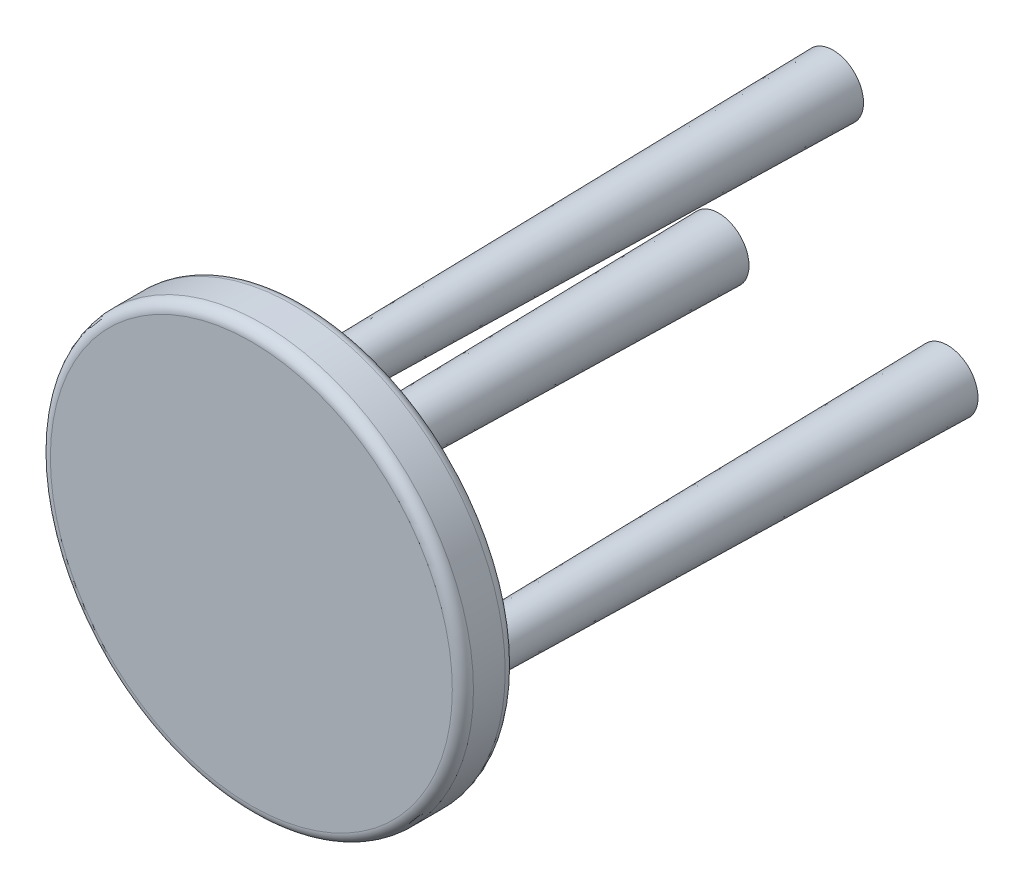
ISO-10303-21;
HEADER;
FILE_DESCRIPTION(('STEP AP214'),'2;1');
FILE_NAME('part.step','',(''),(''),'','','');
FILE_SCHEMA(('AUTOMOTIVE_DESIGN { 1 0 10303 214 1 1 1 1 }'));
ENDSEC;
DATA;
#1=APPLICATION_CONTEXT('core data for automotive mechanical design processes');
#2=APPLICATION_PROTOCOL_DEFINITION('international standard','automotive_design',2000,#1);
#3=PRODUCT_CONTEXT('',#1,'mechanical');
#4=PRODUCT('Part','Part','',(#3));
#5=PRODUCT_RELATED_PRODUCT_CATEGORY('part','',(#4));
#6=PRODUCT_DEFINITION_FORMATION('','',#4);
#7=PRODUCT_DEFINITION_CONTEXT('part definition',#1,'design');
#8=PRODUCT_DEFINITION('design','',#6,#7);
#9=PRODUCT_DEFINITION_SHAPE('','',#8);
#10=(LENGTH_UNIT() NAMED_UNIT(*) SI_UNIT(.MILLI.,.METRE.));
#11=(NAMED_UNIT(*) PLANE_ANGLE_UNIT() SI_UNIT($,.RADIAN.));
#12=(NAMED_UNIT(*) SI_UNIT($,.STERADIAN.) SOLID_ANGLE_UNIT());
#13=UNCERTAINTY_MEASURE_WITH_UNIT(LENGTH_MEASURE(1.E-05),#10,'distance_accuracy_value','');
#14=(GEOMETRIC_REPRESENTATION_CONTEXT(3) GLOBAL_UNCERTAINTY_ASSIGNED_CONTEXT((#13)) GLOBAL_UNIT_ASSIGNED_CONTEXT((#10,
#11,#12)) REPRESENTATION_CONTEXT('',''));
#15=CARTESIAN_POINT('',(0.,0.,0.));
#16=DIRECTION('',(0.,0.,1.));
#17=DIRECTION('',(1.,0.,0.));
#18=AXIS2_PLACEMENT_3D('',#15,#16,#17);
#19=CARTESIAN_POINT('',(0.,0.,10.));
#20=DIRECTION('',(0.,0.,-1.));
#21=DIRECTION('',(-1.,0.,0.));
#22=AXIS2_PLACEMENT_3D('',#19,#20,#21);
#23=CYLINDRICAL_SURFACE('',#22,40.);
#24=CARTESIAN_POINT('',(0.,0.,2.));
#25=DIRECTION('',(0.,0.,1.));
#26=DIRECTION('',(1.,0.,0.));
#27=AXIS2_PLACEMENT_3D('',#24,#25,#26);
#28=CIRCLE('',#27,40.);
#29=CARTESIAN_POINT('',(40.,0.,2.));
#30=VERTEX_POINT('',#29);
#31=EDGE_CURVE('E60',#30,#30,#28,.T.);
#32=ORIENTED_EDGE('',*,*,#31,.T.);
#33=EDGE_LOOP('',(#32));
#34=FACE_BOUND('',#33,.T.);
#35=CARTESIAN_POINT('',(0.,0.,8.));
#36=DIRECTION('',(0.,0.,1.));
#37=DIRECTION('',(1.,0.,0.));
#38=AXIS2_PLACEMENT_3D('',#35,#36,#37);
#39=CIRCLE('',#38,40.);
#40=CARTESIAN_POINT('',(40.,0.,8.));
#41=VERTEX_POINT('',#40);
#42=EDGE_CURVE('E63',#41,#41,#39,.F.);
#43=ORIENTED_EDGE('',*,*,#42,.T.);
#44=EDGE_LOOP('',(#43));
#45=FACE_BOUND('',#44,.T.);
#46=ADVANCED_FACE('F31',(#34,#45),#23,.T.);
#47=CARTESIAN_POINT('',(0.,0.,10.));
#48=DIRECTION('',(0.,0.,1.));
#49=DIRECTION('',(1.,0.,0.));
#50=AXIS2_PLACEMENT_3D('',#47,#48,#49);
#51=PLANE('',#50);
#52=CARTESIAN_POINT('',(0.,0.,10.));
#53=DIRECTION('',(0.,0.,1.));
#54=DIRECTION('',(1.,0.,0.));
#55=AXIS2_PLACEMENT_3D('',#52,#53,#54);
#56=CIRCLE('',#55,38.);
#57=CARTESIAN_POINT('',(38.,0.,10.));
#58=VERTEX_POINT('',#57);
#59=EDGE_CURVE('E66',#58,#58,#56,.T.);
#60=ORIENTED_EDGE('',*,*,#59,.T.);
#61=EDGE_LOOP('',(#60));
#62=FACE_BOUND('',#61,.T.);
#63=ADVANCED_FACE('F96',(#62),#51,.T.);
#64=CARTESIAN_POINT('',(0.,0.,0.));
#65=DIRECTION('',(0.,0.,1.));
#66=DIRECTION('',(1.,0.,0.));
#67=AXIS2_PLACEMENT_3D('',#64,#65,#66);
#68=PLANE('',#67);
#69=CARTESIAN_POINT('',(1.47375266475338E-12,25.,0.));
#70=DIRECTION('',(0.,0.,1.));
#71=DIRECTION('',(1.,0.,0.));
#72=AXIS2_PLACEMENT_3D('',#69,#70,#71);
#73=CIRCLE('',#72,8.0704295718885);
#74=CARTESIAN_POINT('',(8.07042957188998,25.,0.));
#75=VERTEX_POINT('',#74);
#76=EDGE_CURVE('E46',#75,#75,#73,.T.);
#77=ORIENTED_EDGE('',*,*,#76,.T.);
#78=EDGE_LOOP('',(#77));
#79=FACE_BOUND('',#78,.T.);
#80=CARTESIAN_POINT('',(-21.6506350946105,-12.4999999999994,0.));
#81=DIRECTION('',(0.,0.,1.));
#82=DIRECTION('',(1.,0.,0.));
#83=AXIS2_PLACEMENT_3D('',#80,#81,#82);
#84=CIRCLE('',#83,8.0704295718885);
#85=CARTESIAN_POINT('',(-13.580205522722,-12.4999999999994,0.));
#86=VERTEX_POINT('',#85);
#87=EDGE_CURVE('E51',#86,#86,#84,.T.);
#88=ORIENTED_EDGE('',*,*,#87,.T.);
#89=EDGE_LOOP('',(#88));
#90=FACE_BOUND('',#89,.T.);
#91=CARTESIAN_POINT('',(21.6506350946114,-12.5000000000006,0.));
#92=DIRECTION('',(0.,0.,1.));
#93=DIRECTION('',(1.,0.,0.));
#94=AXIS2_PLACEMENT_3D('',#91,#92,#93);
#95=CIRCLE('',#94,8.0704295718885);
#96=CARTESIAN_POINT('',(29.7210646665,-12.5000000000006,0.));
#97=VERTEX_POINT('',#96);
#98=EDGE_CURVE('E54',#97,#97,#95,.T.);
#99=ORIENTED_EDGE('',*,*,#98,.T.);
#100=EDGE_LOOP('',(#99));
#101=FACE_BOUND('',#100,.T.);
#102=CARTESIAN_POINT('',(0.,0.,0.));
#103=DIRECTION('',(0.,0.,1.));
#104=DIRECTION('',(1.,0.,0.));
#105=AXIS2_PLACEMENT_3D('',#102,#103,#104);
#106=CIRCLE('',#105,38.);
#107=CARTESIAN_POINT('',(38.,0.,0.));
#108=VERTEX_POINT('',#107);
#109=EDGE_CURVE('E57',#108,#108,#106,.F.);
#110=ORIENTED_EDGE('',*,*,#109,.T.);
#111=EDGE_LOOP('',(#110));
#112=FACE_BOUND('',#111,.T.);
#113=ADVANCED_FACE('F104',(#79,#90,#101,#112),#68,.F.);
#114=CARTESIAN_POINT('',(1.47375266475338E-12,25.,0.));
#115=DIRECTION('',(0.,0.,-1.));
#116=DIRECTION('',(1.,0.,0.));
#117=AXIS2_PLACEMENT_3D('',#114,#115,#116);
#118=CONICAL_SURFACE('',#117,4.,0.0174532925199433);
#119=CARTESIAN_POINT('',(1.47375266475338E-12,25.,-4.06980962574915));
#120=DIRECTION('',(0.,0.,1.));
#121=DIRECTION('',(1.,0.,0.));
#122=AXIS2_PLACEMENT_3D('',#119,#120,#121);
#123=CIRCLE('',#122,4.07103879126294);
#124=CARTESIAN_POINT('',(4.07103879126441,25.,-4.06980962574915));
#125=VERTEX_POINT('',#124);
#126=EDGE_CURVE('E42',#125,#125,#123,.F.);
#127=ORIENTED_EDGE('',*,*,#126,.T.);
#128=EDGE_LOOP('',(#127));
#129=FACE_BOUND('',#128,.T.);
#130=CARTESIAN_POINT('',(1.47375266475338E-12,25.,-100.));
#131=DIRECTION('',(0.,0.,1.));
#132=DIRECTION('',(1.,0.,0.));
#133=AXIS2_PLACEMENT_3D('',#130,#131,#132);
#134=CIRCLE('',#133,5.74550649282176);
#135=CARTESIAN_POINT('',(5.74550649282323,25.,-100.));
#136=VERTEX_POINT('',#135);
#137=EDGE_CURVE('E69',#136,#136,#134,.T.);
#138=ORIENTED_EDGE('',*,*,#137,.T.);
#139=EDGE_LOOP('',(#138));
#140=FACE_BOUND('',#139,.T.);
#141=ADVANCED_FACE('F128',(#129,#140),#118,.T.);
#142=CARTESIAN_POINT('',(1.47375266475338E-12,25.,-100.));
#143=DIRECTION('',(0.,0.,1.));
#144=DIRECTION('',(1.,0.,0.));
#145=AXIS2_PLACEMENT_3D('',#142,#143,#144);
#146=PLANE('',#145);
#147=ORIENTED_EDGE('',*,*,#137,.F.);
#148=EDGE_LOOP('',(#147));
#149=FACE_BOUND('',#148,.T.);
#150=ADVANCED_FACE('F139',(#149),#146,.F.);
#151=CARTESIAN_POINT('',(21.6506350946114,-12.5000000000006,0.));
#152=DIRECTION('',(0.,0.,-1.));
#153=DIRECTION('',(1.,0.,0.));
#154=AXIS2_PLACEMENT_3D('',#151,#152,#153);
#155=CONICAL_SURFACE('',#154,4.,0.0174532925199433);
#156=CARTESIAN_POINT('',(21.6506350946114,-12.5000000000006,-4.06980962574915));
#157=DIRECTION('',(0.,0.,1.));
#158=DIRECTION('',(1.,0.,0.));
#159=AXIS2_PLACEMENT_3D('',#156,#157,#158);
#160=CIRCLE('',#159,4.07103879126294);
#161=CARTESIAN_POINT('',(25.7216738858744,-12.5000000000006,-4.06980962574915));
#162=VERTEX_POINT('',#161);
#163=EDGE_CURVE('E10',#162,#162,#160,.F.);
#164=ORIENTED_EDGE('',*,*,#163,.T.);
#165=EDGE_LOOP('',(#164));
#166=FACE_BOUND('',#165,.T.);
#167=CARTESIAN_POINT('',(21.6506350946114,-12.5000000000006,-100.));
#168=DIRECTION('',(0.,0.,1.));
#169=DIRECTION('',(1.,0.,0.));
#170=AXIS2_PLACEMENT_3D('',#167,#168,#169);
#171=CIRCLE('',#170,5.74550649282176);
#172=CARTESIAN_POINT('',(27.3961415874332,-12.5000000000006,-100.));
#173=VERTEX_POINT('',#172);
#174=EDGE_CURVE('E72',#173,#173,#171,.T.);
#175=ORIENTED_EDGE('',*,*,#174,.T.);
#176=EDGE_LOOP('',(#175));
#177=FACE_BOUND('',#176,.T.);
#178=ADVANCED_FACE('F148',(#166,#177),#155,.T.);
#179=CARTESIAN_POINT('',(21.6506350946114,-12.5000000000006,-100.));
#180=DIRECTION('',(0.,0.,1.));
#181=DIRECTION('',(1.,0.,0.));
#182=AXIS2_PLACEMENT_3D('',#179,#180,#181);
#183=PLANE('',#182);
#184=ORIENTED_EDGE('',*,*,#174,.F.);
#185=EDGE_LOOP('',(#184));
#186=FACE_BOUND('',#185,.T.);
#187=ADVANCED_FACE('F93',(#186),#183,.F.);
#188=CARTESIAN_POINT('',(-21.6506350946105,-12.4999999999994,0.));
#189=DIRECTION('',(0.,0.,-1.));
#190=DIRECTION('',(1.,0.,0.));
#191=AXIS2_PLACEMENT_3D('',#188,#189,#190);
#192=CONICAL_SURFACE('',#191,4.,0.0174532925199433);
#193=CARTESIAN_POINT('',(-21.6506350946105,-12.4999999999994,-4.06980962574915));
#194=DIRECTION('',(0.,0.,1.));
#195=DIRECTION('',(1.,0.,0.));
#196=AXIS2_PLACEMENT_3D('',#193,#194,#195);
#197=CIRCLE('',#196,4.07103879126294);
#198=CARTESIAN_POINT('',(-17.5795963033476,-12.4999999999994,-4.06980962574915));
#199=VERTEX_POINT('',#198);
#200=EDGE_CURVE('E38',#199,#199,#197,.F.);
#201=ORIENTED_EDGE('',*,*,#200,.T.);
#202=EDGE_LOOP('',(#201));
#203=FACE_BOUND('',#202,.T.);
#204=CARTESIAN_POINT('',(-21.6506350946105,-12.4999999999994,-100.));
#205=DIRECTION('',(0.,0.,1.));
#206=DIRECTION('',(1.,0.,0.));
#207=AXIS2_PLACEMENT_3D('',#204,#205,#206);
#208=CIRCLE('',#207,5.74550649282176);
#209=CARTESIAN_POINT('',(-15.9051286017887,-12.4999999999994,-100.));
#210=VERTEX_POINT('',#209);
#211=EDGE_CURVE('E75',#210,#210,#208,.T.);
#212=ORIENTED_EDGE('',*,*,#211,.T.);
#213=EDGE_LOOP('',(#212));
#214=FACE_BOUND('',#213,.T.);
#215=ADVANCED_FACE('F79',(#203,#214),#192,.T.);
#216=CARTESIAN_POINT('',(-21.6506350946105,-12.4999999999994,-100.));
#217=DIRECTION('',(0.,0.,1.));
#218=DIRECTION('',(1.,0.,0.));
#219=AXIS2_PLACEMENT_3D('',#216,#217,#218);
#220=PLANE('',#219);
#221=ORIENTED_EDGE('',*,*,#211,.F.);
#222=EDGE_LOOP('',(#221));
#223=FACE_BOUND('',#222,.T.);
#224=ADVANCED_FACE('F81',(#223),#220,.F.);
#225=CARTESIAN_POINT('',(0.,0.,8.));
#226=DIRECTION('',(0.,0.,1.));
#227=DIRECTION('',(1.,0.,0.));
#228=AXIS2_PLACEMENT_3D('',#225,#226,#227);
#229=TOROIDAL_SURFACE('',#228,38.,2.);
#230=ORIENTED_EDGE('',*,*,#42,.F.);
#231=EDGE_LOOP('',(#230));
#232=FACE_BOUND('',#231,.T.);
#233=ORIENTED_EDGE('',*,*,#59,.F.);
#234=EDGE_LOOP('',(#233));
#235=FACE_BOUND('',#234,.T.);
#236=ADVANCED_FACE('F83',(#232,#235),#229,.T.);
#237=CARTESIAN_POINT('',(0.,0.,2.));
#238=DIRECTION('',(0.,0.,1.));
#239=DIRECTION('',(1.,0.,0.));
#240=AXIS2_PLACEMENT_3D('',#237,#238,#239);
#241=TOROIDAL_SURFACE('',#240,38.,2.);
#242=ORIENTED_EDGE('',*,*,#109,.F.);
#243=EDGE_LOOP('',(#242));
#244=FACE_BOUND('',#243,.T.);
#245=ORIENTED_EDGE('',*,*,#31,.F.);
#246=EDGE_LOOP('',(#245));
#247=FACE_BOUND('',#246,.T.);
#248=ADVANCED_FACE('F89',(#244,#247),#241,.T.);
#249=CARTESIAN_POINT('',(1.47375266475338E-12,25.,-4.));
#250=DIRECTION('',(0.,0.,1.));
#251=DIRECTION('',(1.,0.,0.));
#252=AXIS2_PLACEMENT_3D('',#249,#250,#251);
#253=TOROIDAL_SURFACE('',#252,8.0704295718885,4.);
#254=ORIENTED_EDGE('',*,*,#126,.F.);
#255=EDGE_LOOP('',(#254));
#256=FACE_BOUND('',#255,.T.);
#257=ORIENTED_EDGE('',*,*,#76,.F.);
#258=EDGE_LOOP('',(#257));
#259=FACE_BOUND('',#258,.T.);
#260=ADVANCED_FACE('F112',(#256,#259),#253,.F.);
#261=CARTESIAN_POINT('',(-21.6506350946105,-12.4999999999994,-4.));
#262=DIRECTION('',(0.,0.,1.));
#263=DIRECTION('',(1.,0.,0.));
#264=AXIS2_PLACEMENT_3D('',#261,#262,#263);
#265=TOROIDAL_SURFACE('',#264,8.0704295718885,4.);
#266=ORIENTED_EDGE('',*,*,#200,.F.);
#267=EDGE_LOOP('',(#266));
#268=FACE_BOUND('',#267,.T.);
#269=ORIENTED_EDGE('',*,*,#87,.F.);
#270=EDGE_LOOP('',(#269));
#271=FACE_BOUND('',#270,.T.);
#272=ADVANCED_FACE('F115',(#268,#271),#265,.F.);
#273=CARTESIAN_POINT('',(21.6506350946114,-12.5000000000006,-4.));
#274=DIRECTION('',(0.,0.,1.));
#275=DIRECTION('',(1.,0.,0.));
#276=AXIS2_PLACEMENT_3D('',#273,#274,#275);
#277=TOROIDAL_SURFACE('',#276,8.0704295718885,4.);
#278=ORIENTED_EDGE('',*,*,#163,.F.);
#279=EDGE_LOOP('',(#278));
#280=FACE_BOUND('',#279,.T.);
#281=ORIENTED_EDGE('',*,*,#98,.F.);
#282=EDGE_LOOP('',(#281));
#283=FACE_BOUND('',#282,.T.);
#284=ADVANCED_FACE('F33',(#280,#283),#277,.F.);
#285=CLOSED_SHELL('',(#46,#63,#113,#141,#150,#178,#187,#215,#224,#236,#248,#260,#272,#284));
#286=MANIFOLD_SOLID_BREP('B2',#285);
#287=ADVANCED_BREP_SHAPE_REPRESENTATION('',(#18,#286),#14);
#288=SHAPE_DEFINITION_REPRESENTATION(#9,#287);
ENDSEC;
END-ISO-10303-21;
